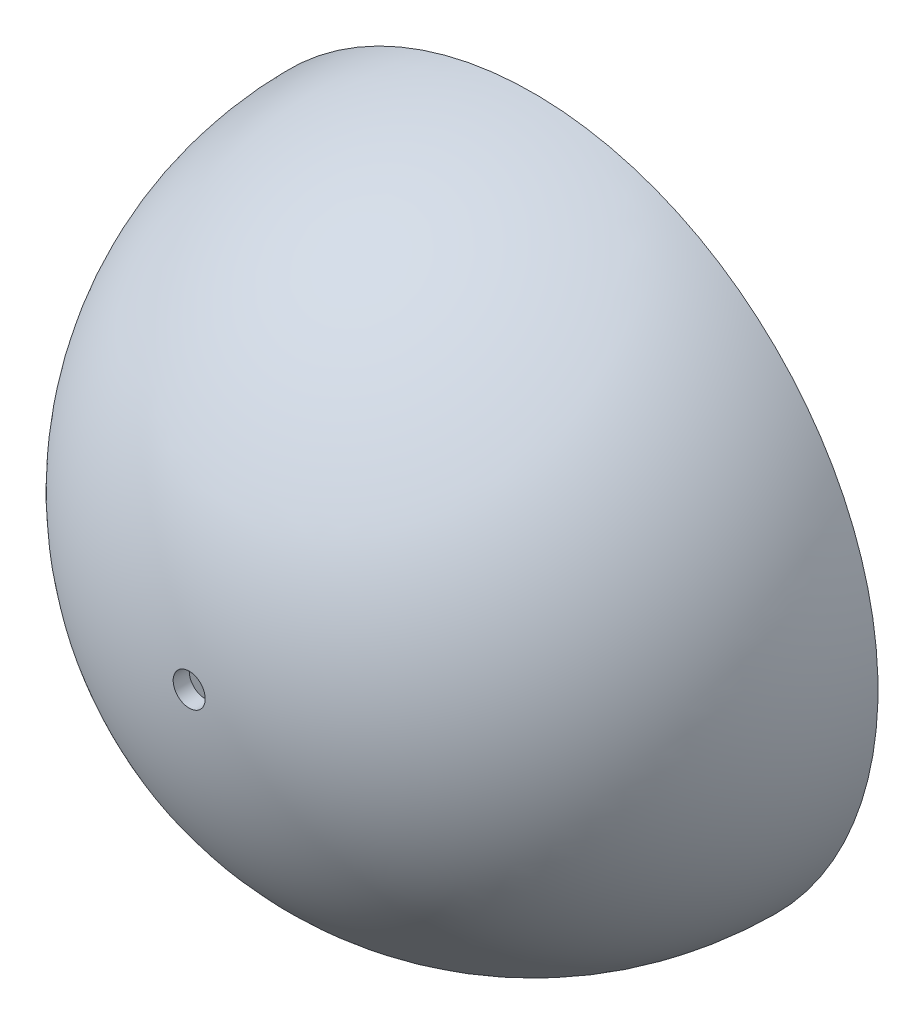
ISO-10303-21;
HEADER;
FILE_DESCRIPTION(('STEP AP214'),'2;1');
FILE_NAME('part.step','',(''),(''),'','','');
FILE_SCHEMA(('AUTOMOTIVE_DESIGN { 1 0 10303 214 1 1 1 1 }'));
ENDSEC;
DATA;
#1=APPLICATION_CONTEXT('core data for automotive mechanical design processes');
#2=APPLICATION_PROTOCOL_DEFINITION('international standard','automotive_design',2000,#1);
#3=PRODUCT_CONTEXT('',#1,'mechanical');
#4=PRODUCT('Part','Part','',(#3));
#5=PRODUCT_RELATED_PRODUCT_CATEGORY('part','',(#4));
#6=PRODUCT_DEFINITION_FORMATION('','',#4);
#7=PRODUCT_DEFINITION_CONTEXT('part definition',#1,'design');
#8=PRODUCT_DEFINITION('design','',#6,#7);
#9=PRODUCT_DEFINITION_SHAPE('','',#8);
#10=(LENGTH_UNIT() NAMED_UNIT(*) SI_UNIT(.MILLI.,.METRE.));
#11=(NAMED_UNIT(*) PLANE_ANGLE_UNIT() SI_UNIT($,.RADIAN.));
#12=(NAMED_UNIT(*) SI_UNIT($,.STERADIAN.) SOLID_ANGLE_UNIT());
#13=UNCERTAINTY_MEASURE_WITH_UNIT(LENGTH_MEASURE(1.E-05),#10,'distance_accuracy_value','');
#14=(GEOMETRIC_REPRESENTATION_CONTEXT(3) GLOBAL_UNCERTAINTY_ASSIGNED_CONTEXT((#13)) GLOBAL_UNIT_ASSIGNED_CONTEXT((#10,
#11,#12)) REPRESENTATION_CONTEXT('',''));
#15=CARTESIAN_POINT('',(0.,0.,0.));
#16=DIRECTION('',(0.,0.,1.));
#17=DIRECTION('',(1.,0.,0.));
#18=AXIS2_PLACEMENT_3D('',#15,#16,#17);
#19=CARTESIAN_POINT('',(0.,0.,0.));
#20=DIRECTION('',(0.,1.,0.));
#21=DIRECTION('',(-1.,0.,0.));
#22=AXIS2_PLACEMENT_3D('',#19,#20,#21);
#23=SPHERICAL_SURFACE('',#22,215.);
#24=CARTESIAN_POINT('',(0.,0.,0.));
#25=DIRECTION('',(0.,0.,-1.));
#26=DIRECTION('',(-1.,0.,0.));
#27=AXIS2_PLACEMENT_3D('',#24,#25,#26);
#28=SPHERICAL_SURFACE('',#27,215.);
#29=CARTESIAN_POINT('',(0.,0.,0.));
#30=DIRECTION('',(0.,0.,-1.));
#31=DIRECTION('',(-1.,0.,0.));
#32=AXIS2_PLACEMENT_3D('',#29,#30,#31);
#33=CIRCLE('',#32,215.);
#34=CARTESIAN_POINT('',(-215.,0.,-1.50133697570255E-12));
#35=VERTEX_POINT('',#34);
#36=EDGE_CURVE('E10',#35,#35,#33,.T.);
#37=ORIENTED_EDGE('',*,*,#36,.F.);
#38=EDGE_LOOP('',(#37));
#39=FACE_BOUND('',#38,.T.);
#40=CARTESIAN_POINT('',(0.,0.,214.767315949145));
#41=DIRECTION('',(0.,0.,-1.));
#42=DIRECTION('',(-1.,0.,0.));
#43=AXIS2_PLACEMENT_3D('',#40,#41,#42);
#44=CIRCLE('',#43,10.);
#45=CARTESIAN_POINT('',(-10.,0.,214.767315949145));
#46=VERTEX_POINT('',#45);
#47=EDGE_CURVE('E54',#46,#46,#44,.F.);
#48=ORIENTED_EDGE('',*,*,#47,.F.);
#49=EDGE_LOOP('',(#48));
#50=FACE_BOUND('',#49,.T.);
#51=ADVANCED_FACE('F41',(#39,#50),#28,.T.);
#52=CARTESIAN_POINT('',(0.,0.,0.));
#53=DIRECTION('',(0.,-1.,0.));
#54=DIRECTION('',(-1.,0.,0.));
#55=AXIS2_PLACEMENT_3D('',#52,#53,#54);
#56=SPHERICAL_SURFACE('',#55,205.);
#57=CARTESIAN_POINT('',(0.,0.,0.));
#58=DIRECTION('',(0.,0.,1.));
#59=DIRECTION('',(1.,0.,0.));
#60=AXIS2_PLACEMENT_3D('',#57,#58,#59);
#61=SPHERICAL_SURFACE('',#60,205.);
#62=CARTESIAN_POINT('',(0.,0.,0.));
#63=DIRECTION('',(0.,0.,1.));
#64=DIRECTION('',(1.,0.,0.));
#65=AXIS2_PLACEMENT_3D('',#62,#63,#64);
#66=CIRCLE('',#65,205.);
#67=CARTESIAN_POINT('',(205.,0.,0.));
#68=VERTEX_POINT('',#67);
#69=EDGE_CURVE('E49',#68,#68,#66,.T.);
#70=ORIENTED_EDGE('',*,*,#69,.F.);
#71=EDGE_LOOP('',(#70));
#72=FACE_BOUND('',#71,.T.);
#73=CARTESIAN_POINT('',(0.,0.,204.755952294433));
#74=DIRECTION('',(0.,0.,-1.));
#75=DIRECTION('',(-1.,0.,0.));
#76=AXIS2_PLACEMENT_3D('',#73,#74,#75);
#77=CIRCLE('',#76,10.);
#78=CARTESIAN_POINT('',(-10.,0.,204.755952294433));
#79=VERTEX_POINT('',#78);
#80=EDGE_CURVE('E44',#79,#79,#77,.T.);
#81=ORIENTED_EDGE('',*,*,#80,.F.);
#82=EDGE_LOOP('',(#81));
#83=FACE_BOUND('',#82,.T.);
#84=ADVANCED_FACE('F67',(#72,#83),#61,.F.);
#85=CARTESIAN_POINT('',(0.,0.,0.));
#86=DIRECTION('',(0.,0.,-1.));
#87=DIRECTION('',(-1.,0.,0.));
#88=AXIS2_PLACEMENT_3D('',#85,#86,#87);
#89=PLANE('',#88);
#90=ORIENTED_EDGE('',*,*,#69,.T.);
#91=EDGE_LOOP('',(#90));
#92=FACE_BOUND('',#91,.T.);
#93=ORIENTED_EDGE('',*,*,#36,.T.);
#94=EDGE_LOOP('',(#93));
#95=FACE_BOUND('',#94,.T.);
#96=ADVANCED_FACE('F69',(#92,#95),#89,.T.);
#97=CARTESIAN_POINT('',(0.,0.,362.));
#98=DIRECTION('',(0.,0.,-1.));
#99=DIRECTION('',(-1.,0.,0.));
#100=AXIS2_PLACEMENT_3D('',#97,#98,#99);
#101=CYLINDRICAL_SURFACE('',#100,10.);
#102=ORIENTED_EDGE('',*,*,#80,.T.);
#103=EDGE_LOOP('',(#102));
#104=FACE_BOUND('',#103,.T.);
#105=ORIENTED_EDGE('',*,*,#47,.T.);
#106=EDGE_LOOP('',(#105));
#107=FACE_BOUND('',#106,.T.);
#108=ADVANCED_FACE('F65',(#104,#107),#101,.F.);
#109=CLOSED_SHELL('',(#51,#84,#96,#108));
#110=MANIFOLD_SOLID_BREP('B2',#109);
#111=ADVANCED_BREP_SHAPE_REPRESENTATION('',(#18,#110),#14);
#112=SHAPE_DEFINITION_REPRESENTATION(#9,#111);
ENDSEC;
END-ISO-10303-21;
